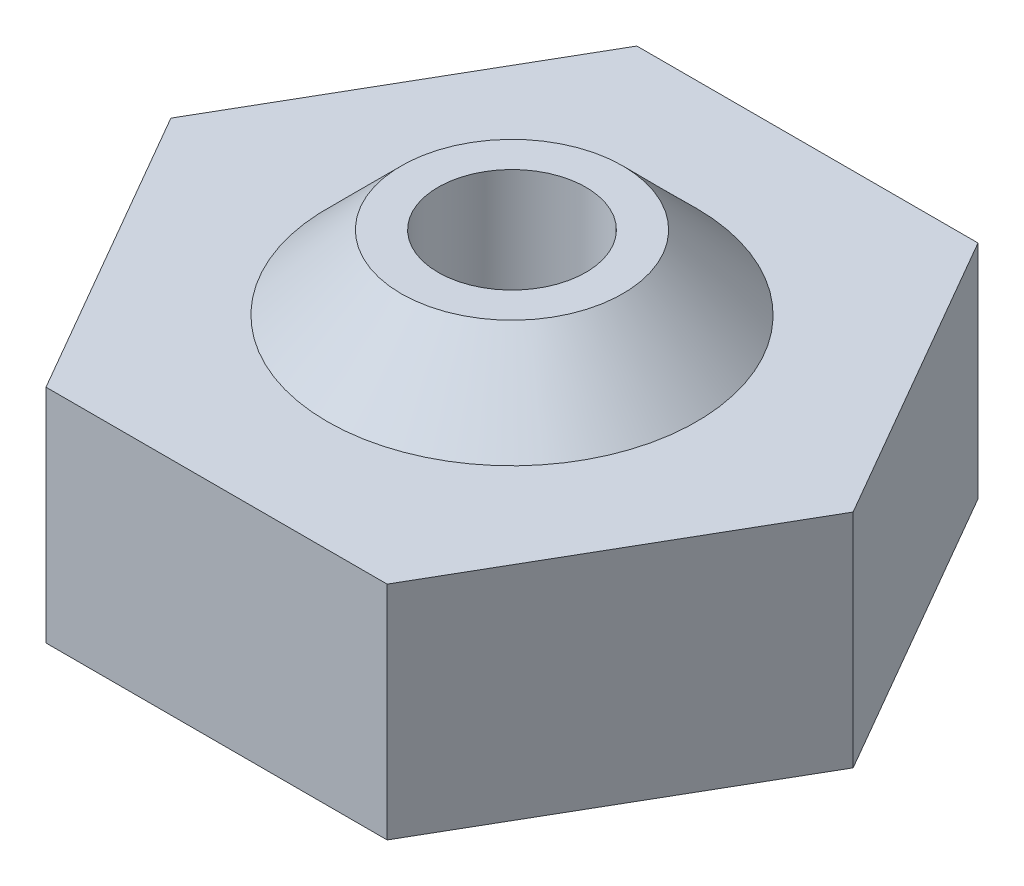
ISO-10303-21;
HEADER;
FILE_DESCRIPTION(('STEP AP214'),'2;1');
FILE_NAME('part.step','',(''),(''),'','','');
FILE_SCHEMA(('AUTOMOTIVE_DESIGN { 1 0 10303 214 1 1 1 1 }'));
ENDSEC;
DATA;
#1=APPLICATION_CONTEXT('core data for automotive mechanical design processes');
#2=APPLICATION_PROTOCOL_DEFINITION('international standard','automotive_design',2000,#1);
#3=PRODUCT_CONTEXT('',#1,'mechanical');
#4=PRODUCT('Part','Part','',(#3));
#5=PRODUCT_RELATED_PRODUCT_CATEGORY('part','',(#4));
#6=PRODUCT_DEFINITION_FORMATION('','',#4);
#7=PRODUCT_DEFINITION_CONTEXT('part definition',#1,'design');
#8=PRODUCT_DEFINITION('design','',#6,#7);
#9=PRODUCT_DEFINITION_SHAPE('','',#8);
#10=(LENGTH_UNIT() NAMED_UNIT(*) SI_UNIT(.MILLI.,.METRE.));
#11=(NAMED_UNIT(*) PLANE_ANGLE_UNIT() SI_UNIT($,.RADIAN.));
#12=(NAMED_UNIT(*) SI_UNIT($,.STERADIAN.) SOLID_ANGLE_UNIT());
#13=UNCERTAINTY_MEASURE_WITH_UNIT(LENGTH_MEASURE(1.E-05),#10,'distance_accuracy_value','');
#14=(GEOMETRIC_REPRESENTATION_CONTEXT(3) GLOBAL_UNCERTAINTY_ASSIGNED_CONTEXT((#13)) GLOBAL_UNIT_ASSIGNED_CONTEXT((#10,
#11,#12)) REPRESENTATION_CONTEXT('',''));
#15=CARTESIAN_POINT('',(0.,0.,0.));
#16=DIRECTION('',(0.,0.,1.));
#17=DIRECTION('',(1.,0.,0.));
#18=AXIS2_PLACEMENT_3D('',#15,#16,#17);
#19=CARTESIAN_POINT('',(0.,0.,0.));
#20=DIRECTION('',(0.,1.,0.));
#21=DIRECTION('',(0.,0.,1.));
#22=AXIS2_PLACEMENT_3D('',#19,#20,#21);
#23=CYLINDRICAL_SURFACE('',#22,5.);
#24=CARTESIAN_POINT('',(0.,20.,0.));
#25=DIRECTION('',(0.,1.,0.));
#26=DIRECTION('',(0.,0.,1.));
#27=AXIS2_PLACEMENT_3D('',#24,#25,#26);
#28=CIRCLE('',#27,5.);
#29=CARTESIAN_POINT('',(0.,20.,5.));
#30=VERTEX_POINT('',#29);
#31=EDGE_CURVE('E123',#30,#30,#28,.T.);
#32=ORIENTED_EDGE('',*,*,#31,.T.);
#33=EDGE_LOOP('',(#32));
#34=FACE_BOUND('',#33,.T.);
#35=CARTESIAN_POINT('',(0.,5.,0.));
#36=DIRECTION('',(0.,-1.,0.));
#37=DIRECTION('',(0.,0.,-1.));
#38=AXIS2_PLACEMENT_3D('',#35,#36,#37);
#39=CIRCLE('',#38,5.);
#40=CARTESIAN_POINT('',(0.,5.,-5.));
#41=VERTEX_POINT('',#40);
#42=EDGE_CURVE('E36',#41,#41,#39,.F.);
#43=ORIENTED_EDGE('',*,*,#42,.F.);
#44=EDGE_LOOP('',(#43));
#45=FACE_BOUND('',#44,.T.);
#46=ADVANCED_FACE('F32',(#34,#45),#23,.F.);
#47=CARTESIAN_POINT('',(23.094010767585,15.,0.));
#48=DIRECTION('',(-0.866025403784439,0.,0.5));
#49=DIRECTION('',(0.5,0.,0.866025403784439));
#50=AXIS2_PLACEMENT_3D('',#47,#48,#49);
#51=PLANE('',#50);
#52=DIRECTION('',(-0.5,0.,-0.866025403784439));
#53=VECTOR('',#52,1.);
#54=CARTESIAN_POINT('',(23.094010767585,0.,0.));
#55=LINE('',#54,#53);
#56=CARTESIAN_POINT('',(23.094010767585,0.,0.));
#57=VERTEX_POINT('',#56);
#58=CARTESIAN_POINT('',(11.5470053837925,0.,-20.));
#59=VERTEX_POINT('',#58);
#60=EDGE_CURVE('E119',#57,#59,#55,.T.);
#61=ORIENTED_EDGE('',*,*,#60,.T.);
#62=DIRECTION('',(0.,-1.,0.));
#63=VECTOR('',#62,1.);
#64=CARTESIAN_POINT('',(11.5470053837925,15.,-20.));
#65=LINE('',#64,#63);
#66=CARTESIAN_POINT('',(11.5470053837925,15.,-20.));
#67=VERTEX_POINT('',#66);
#68=EDGE_CURVE('E137',#67,#59,#65,.T.);
#69=ORIENTED_EDGE('',*,*,#68,.F.);
#70=DIRECTION('',(-0.5,0.,-0.866025403784439));
#71=VECTOR('',#70,1.);
#72=CARTESIAN_POINT('',(23.094010767585,15.,0.));
#73=LINE('',#72,#71);
#74=CARTESIAN_POINT('',(23.094010767585,15.,0.));
#75=VERTEX_POINT('',#74);
#76=EDGE_CURVE('E130',#75,#67,#73,.T.);
#77=ORIENTED_EDGE('',*,*,#76,.F.);
#78=DIRECTION('',(0.,-1.,0.));
#79=VECTOR('',#78,1.);
#80=CARTESIAN_POINT('',(23.094010767585,15.,0.));
#81=LINE('',#80,#79);
#82=EDGE_CURVE('E115',#75,#57,#81,.T.);
#83=ORIENTED_EDGE('',*,*,#82,.T.);
#84=EDGE_LOOP('',(#61,#69,#77,#83));
#85=FACE_BOUND('',#84,.T.);
#86=ADVANCED_FACE('F156',(#85),#51,.F.);
#87=CARTESIAN_POINT('',(11.5470053837925,15.,-20.));
#88=DIRECTION('',(0.,0.,1.));
#89=DIRECTION('',(1.,0.,0.));
#90=AXIS2_PLACEMENT_3D('',#87,#88,#89);
#91=PLANE('',#90);
#92=DIRECTION('',(-1.,0.,0.));
#93=VECTOR('',#92,1.);
#94=CARTESIAN_POINT('',(11.5470053837925,0.,-20.));
#95=LINE('',#94,#93);
#96=CARTESIAN_POINT('',(-11.5470053837925,0.,-20.));
#97=VERTEX_POINT('',#96);
#98=EDGE_CURVE('E122',#59,#97,#95,.T.);
#99=ORIENTED_EDGE('',*,*,#98,.T.);
#100=DIRECTION('',(0.,-1.,0.));
#101=VECTOR('',#100,1.);
#102=CARTESIAN_POINT('',(-11.5470053837925,15.,-20.));
#103=LINE('',#102,#101);
#104=CARTESIAN_POINT('',(-11.5470053837925,15.,-20.));
#105=VERTEX_POINT('',#104);
#106=EDGE_CURVE('E134',#105,#97,#103,.T.);
#107=ORIENTED_EDGE('',*,*,#106,.F.);
#108=DIRECTION('',(-1.,0.,0.));
#109=VECTOR('',#108,1.);
#110=CARTESIAN_POINT('',(11.5470053837925,15.,-20.));
#111=LINE('',#110,#109);
#112=EDGE_CURVE('E88',#67,#105,#111,.T.);
#113=ORIENTED_EDGE('',*,*,#112,.F.);
#114=ORIENTED_EDGE('',*,*,#68,.T.);
#115=EDGE_LOOP('',(#99,#107,#113,#114));
#116=FACE_BOUND('',#115,.T.);
#117=ADVANCED_FACE('F148',(#116),#91,.F.);
#118=CARTESIAN_POINT('',(-11.5470053837925,15.,-20.));
#119=DIRECTION('',(0.866025403784439,0.,0.5));
#120=DIRECTION('',(0.5,0.,-0.866025403784439));
#121=AXIS2_PLACEMENT_3D('',#118,#119,#120);
#122=PLANE('',#121);
#123=DIRECTION('',(-0.5,0.,0.866025403784439));
#124=VECTOR('',#123,1.);
#125=CARTESIAN_POINT('',(-11.5470053837925,0.,-20.));
#126=LINE('',#125,#124);
#127=CARTESIAN_POINT('',(-23.094010767585,0.,0.));
#128=VERTEX_POINT('',#127);
#129=EDGE_CURVE('E125',#97,#128,#126,.T.);
#130=ORIENTED_EDGE('',*,*,#129,.T.);
#131=DIRECTION('',(0.,-1.,0.));
#132=VECTOR('',#131,1.);
#133=CARTESIAN_POINT('',(-23.094010767585,15.,0.));
#134=LINE('',#133,#132);
#135=CARTESIAN_POINT('',(-23.094010767585,15.,0.));
#136=VERTEX_POINT('',#135);
#137=EDGE_CURVE('E110',#136,#128,#134,.T.);
#138=ORIENTED_EDGE('',*,*,#137,.F.);
#139=DIRECTION('',(-0.5,0.,0.866025403784439));
#140=VECTOR('',#139,1.);
#141=CARTESIAN_POINT('',(-11.5470053837925,15.,-20.));
#142=LINE('',#141,#140);
#143=EDGE_CURVE('E101',#105,#136,#142,.T.);
#144=ORIENTED_EDGE('',*,*,#143,.F.);
#145=ORIENTED_EDGE('',*,*,#106,.T.);
#146=EDGE_LOOP('',(#130,#138,#144,#145));
#147=FACE_BOUND('',#146,.T.);
#148=ADVANCED_FACE('F151',(#147),#122,.F.);
#149=CARTESIAN_POINT('',(-23.094010767585,15.,0.));
#150=DIRECTION('',(0.866025403784439,0.,-0.5));
#151=DIRECTION('',(-0.5,0.,-0.866025403784439));
#152=AXIS2_PLACEMENT_3D('',#149,#150,#151);
#153=PLANE('',#152);
#154=DIRECTION('',(0.5,0.,0.866025403784439));
#155=VECTOR('',#154,1.);
#156=CARTESIAN_POINT('',(-23.094010767585,0.,0.));
#157=LINE('',#156,#155);
#158=CARTESIAN_POINT('',(-11.5470053837925,0.,20.));
#159=VERTEX_POINT('',#158);
#160=EDGE_CURVE('E109',#128,#159,#157,.T.);
#161=ORIENTED_EDGE('',*,*,#160,.T.);
#162=DIRECTION('',(0.,-1.,0.));
#163=VECTOR('',#162,1.);
#164=CARTESIAN_POINT('',(-11.5470053837925,15.,20.));
#165=LINE('',#164,#163);
#166=CARTESIAN_POINT('',(-11.5470053837925,15.,20.));
#167=VERTEX_POINT('',#166);
#168=EDGE_CURVE('E106',#167,#159,#165,.T.);
#169=ORIENTED_EDGE('',*,*,#168,.F.);
#170=DIRECTION('',(0.5,0.,0.866025403784439));
#171=VECTOR('',#170,1.);
#172=CARTESIAN_POINT('',(-23.094010767585,15.,0.));
#173=LINE('',#172,#171);
#174=EDGE_CURVE('E95',#136,#167,#173,.T.);
#175=ORIENTED_EDGE('',*,*,#174,.F.);
#176=ORIENTED_EDGE('',*,*,#137,.T.);
#177=EDGE_LOOP('',(#161,#169,#175,#176));
#178=FACE_BOUND('',#177,.T.);
#179=ADVANCED_FACE('F107',(#178),#153,.F.);
#180=CARTESIAN_POINT('',(-11.5470053837925,15.,20.));
#181=DIRECTION('',(0.,0.,-1.));
#182=DIRECTION('',(-1.,0.,0.));
#183=AXIS2_PLACEMENT_3D('',#180,#181,#182);
#184=PLANE('',#183);
#185=DIRECTION('',(1.,0.,0.));
#186=VECTOR('',#185,1.);
#187=CARTESIAN_POINT('',(-11.5470053837925,0.,20.));
#188=LINE('',#187,#186);
#189=CARTESIAN_POINT('',(11.5470053837925,0.,20.));
#190=VERTEX_POINT('',#189);
#191=EDGE_CURVE('E73',#159,#190,#188,.T.);
#192=ORIENTED_EDGE('',*,*,#191,.T.);
#193=DIRECTION('',(0.,-1.,0.));
#194=VECTOR('',#193,1.);
#195=CARTESIAN_POINT('',(11.5470053837925,15.,20.));
#196=LINE('',#195,#194);
#197=CARTESIAN_POINT('',(11.5470053837925,15.,20.));
#198=VERTEX_POINT('',#197);
#199=EDGE_CURVE('E111',#198,#190,#196,.T.);
#200=ORIENTED_EDGE('',*,*,#199,.F.);
#201=DIRECTION('',(1.,0.,0.));
#202=VECTOR('',#201,1.);
#203=CARTESIAN_POINT('',(-11.5470053837925,15.,20.));
#204=LINE('',#203,#202);
#205=EDGE_CURVE('E99',#167,#198,#204,.T.);
#206=ORIENTED_EDGE('',*,*,#205,.F.);
#207=ORIENTED_EDGE('',*,*,#168,.T.);
#208=EDGE_LOOP('',(#192,#200,#206,#207));
#209=FACE_BOUND('',#208,.T.);
#210=ADVANCED_FACE('F113',(#209),#184,.F.);
#211=CARTESIAN_POINT('',(11.5470053837925,15.,20.));
#212=DIRECTION('',(-0.866025403784439,0.,-0.5));
#213=DIRECTION('',(-0.5,0.,0.866025403784439));
#214=AXIS2_PLACEMENT_3D('',#211,#212,#213);
#215=PLANE('',#214);
#216=DIRECTION('',(0.5,0.,-0.866025403784439));
#217=VECTOR('',#216,1.);
#218=CARTESIAN_POINT('',(11.5470053837925,0.,20.));
#219=LINE('',#218,#217);
#220=EDGE_CURVE('E79',#190,#57,#219,.T.);
#221=ORIENTED_EDGE('',*,*,#220,.T.);
#222=ORIENTED_EDGE('',*,*,#82,.F.);
#223=DIRECTION('',(0.5,0.,-0.866025403784439));
#224=VECTOR('',#223,1.);
#225=CARTESIAN_POINT('',(11.5470053837925,15.,20.));
#226=LINE('',#225,#224);
#227=EDGE_CURVE('E50',#198,#75,#226,.T.);
#228=ORIENTED_EDGE('',*,*,#227,.F.);
#229=ORIENTED_EDGE('',*,*,#199,.T.);
#230=EDGE_LOOP('',(#221,#222,#228,#229));
#231=FACE_BOUND('',#230,.T.);
#232=ADVANCED_FACE('F157',(#231),#215,.F.);
#233=CARTESIAN_POINT('',(0.,15.,0.));
#234=DIRECTION('',(0.,1.,0.));
#235=DIRECTION('',(0.,0.,1.));
#236=AXIS2_PLACEMENT_3D('',#233,#234,#235);
#237=PLANE('',#236);
#238=CARTESIAN_POINT('',(0.,15.,0.));
#239=DIRECTION('',(0.,1.,0.));
#240=DIRECTION('',(0.,0.,1.));
#241=AXIS2_PLACEMENT_3D('',#238,#239,#240);
#242=CIRCLE('',#241,12.5);
#243=CARTESIAN_POINT('',(0.,15.,12.5));
#244=VERTEX_POINT('',#243);
#245=EDGE_CURVE('E42',#244,#244,#242,.T.);
#246=ORIENTED_EDGE('',*,*,#245,.F.);
#247=EDGE_LOOP('',(#246));
#248=FACE_BOUND('',#247,.T.);
#249=ORIENTED_EDGE('',*,*,#76,.T.);
#250=ORIENTED_EDGE('',*,*,#112,.T.);
#251=ORIENTED_EDGE('',*,*,#143,.T.);
#252=ORIENTED_EDGE('',*,*,#174,.T.);
#253=ORIENTED_EDGE('',*,*,#205,.T.);
#254=ORIENTED_EDGE('',*,*,#227,.T.);
#255=EDGE_LOOP('',(#249,#250,#251,#252,#253,#254));
#256=FACE_BOUND('',#255,.T.);
#257=ADVANCED_FACE('F97',(#248,#256),#237,.T.);
#258=CARTESIAN_POINT('',(0.,0.,0.));
#259=DIRECTION('',(0.,1.,0.));
#260=DIRECTION('',(0.,0.,1.));
#261=AXIS2_PLACEMENT_3D('',#258,#259,#260);
#262=PLANE('',#261);
#263=CARTESIAN_POINT('',(0.,0.,0.));
#264=DIRECTION('',(0.,-1.,0.));
#265=DIRECTION('',(0.,0.,-1.));
#266=AXIS2_PLACEMENT_3D('',#263,#264,#265);
#267=CIRCLE('',#266,12.5);
#268=CARTESIAN_POINT('',(0.,0.,-12.5));
#269=VERTEX_POINT('',#268);
#270=EDGE_CURVE('E189',#269,#269,#267,.T.);
#271=ORIENTED_EDGE('',*,*,#270,.F.);
#272=EDGE_LOOP('',(#271));
#273=FACE_BOUND('',#272,.T.);
#274=ORIENTED_EDGE('',*,*,#60,.F.);
#275=ORIENTED_EDGE('',*,*,#220,.F.);
#276=ORIENTED_EDGE('',*,*,#191,.F.);
#277=ORIENTED_EDGE('',*,*,#160,.F.);
#278=ORIENTED_EDGE('',*,*,#129,.F.);
#279=ORIENTED_EDGE('',*,*,#98,.F.);
#280=EDGE_LOOP('',(#274,#275,#276,#277,#278,#279));
#281=FACE_BOUND('',#280,.T.);
#282=ADVANCED_FACE('F154',(#273,#281),#262,.F.);
#283=CARTESIAN_POINT('',(0.,20.,0.));
#284=DIRECTION('',(0.,1.,0.));
#285=DIRECTION('',(0.,0.,1.));
#286=AXIS2_PLACEMENT_3D('',#283,#284,#285);
#287=PLANE('',#286);
#288=CARTESIAN_POINT('',(0.,20.,0.));
#289=DIRECTION('',(0.,1.,0.));
#290=DIRECTION('',(0.,0.,1.));
#291=AXIS2_PLACEMENT_3D('',#288,#289,#290);
#292=CIRCLE('',#291,7.5);
#293=CARTESIAN_POINT('',(0.,20.,7.5));
#294=VERTEX_POINT('',#293);
#295=EDGE_CURVE('E11',#294,#294,#292,.T.);
#296=ORIENTED_EDGE('',*,*,#295,.T.);
#297=EDGE_LOOP('',(#296));
#298=FACE_BOUND('',#297,.T.);
#299=ORIENTED_EDGE('',*,*,#31,.F.);
#300=EDGE_LOOP('',(#299));
#301=FACE_BOUND('',#300,.T.);
#302=ADVANCED_FACE('F180',(#298,#301),#287,.T.);
#303=CARTESIAN_POINT('',(0.,20.,0.));
#304=DIRECTION('',(0.,-1.,0.));
#305=DIRECTION('',(0.,0.,-1.));
#306=AXIS2_PLACEMENT_3D('',#303,#304,#305);
#307=CONICAL_SURFACE('',#306,7.5,0.785398163397447);
#308=ORIENTED_EDGE('',*,*,#245,.T.);
#309=EDGE_LOOP('',(#308));
#310=FACE_BOUND('',#309,.T.);
#311=ORIENTED_EDGE('',*,*,#295,.F.);
#312=EDGE_LOOP('',(#311));
#313=FACE_BOUND('',#312,.T.);
#314=ADVANCED_FACE('F34',(#310,#313),#307,.T.);
#315=CARTESIAN_POINT('',(0.,5.,0.));
#316=DIRECTION('',(0.,-1.,0.));
#317=DIRECTION('',(0.,0.,-1.));
#318=AXIS2_PLACEMENT_3D('',#315,#316,#317);
#319=PLANE('',#318);
#320=CARTESIAN_POINT('',(0.,5.,0.));
#321=DIRECTION('',(0.,-1.,0.));
#322=DIRECTION('',(0.,0.,-1.));
#323=AXIS2_PLACEMENT_3D('',#320,#321,#322);
#324=CIRCLE('',#323,12.5);
#325=CARTESIAN_POINT('',(0.,5.,-12.5));
#326=VERTEX_POINT('',#325);
#327=EDGE_CURVE('E191',#326,#326,#324,.T.);
#328=ORIENTED_EDGE('',*,*,#327,.T.);
#329=EDGE_LOOP('',(#328));
#330=FACE_BOUND('',#329,.T.);
#331=ORIENTED_EDGE('',*,*,#42,.T.);
#332=EDGE_LOOP('',(#331));
#333=FACE_BOUND('',#332,.T.);
#334=ADVANCED_FACE('F201',(#330,#333),#319,.T.);
#335=CARTESIAN_POINT('',(0.,5.,0.));
#336=DIRECTION('',(0.,-1.,0.));
#337=DIRECTION('',(0.,0.,-1.));
#338=AXIS2_PLACEMENT_3D('',#335,#336,#337);
#339=CYLINDRICAL_SURFACE('',#338,12.5);
#340=ORIENTED_EDGE('',*,*,#327,.F.);
#341=EDGE_LOOP('',(#340));
#342=FACE_BOUND('',#341,.T.);
#343=ORIENTED_EDGE('',*,*,#270,.T.);
#344=EDGE_LOOP('',(#343));
#345=FACE_BOUND('',#344,.T.);
#346=ADVANCED_FACE('F178',(#342,#345),#339,.F.);
#347=CLOSED_SHELL('',(#46,#86,#117,#148,#179,#210,#232,#257,#282,#302,#314,#334,#346));
#348=MANIFOLD_SOLID_BREP('B2',#347);
#349=ADVANCED_BREP_SHAPE_REPRESENTATION('',(#18,#348),#14);
#350=SHAPE_DEFINITION_REPRESENTATION(#9,#349);
ENDSEC;
END-ISO-10303-21;
